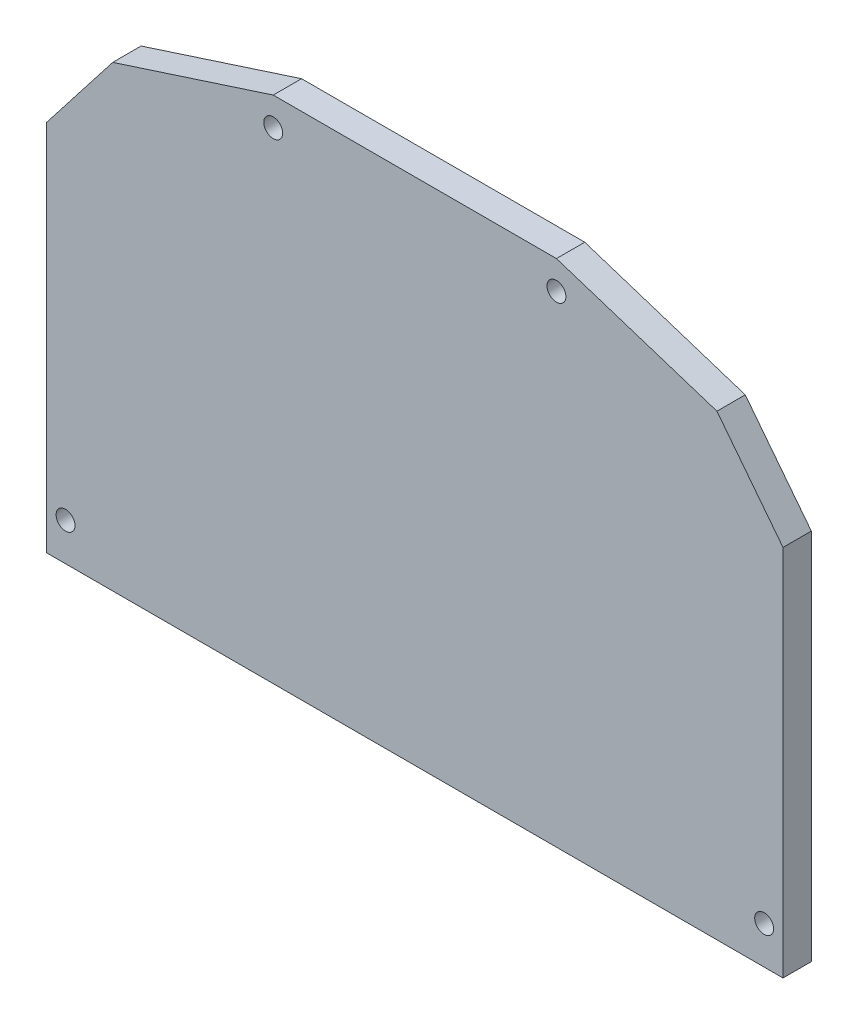
ISO-10303-21;
HEADER;
FILE_DESCRIPTION(('STEP AP214'),'2;1');
FILE_NAME('part.step','',(''),(''),'','','');
FILE_SCHEMA(('AUTOMOTIVE_DESIGN { 1 0 10303 214 1 1 1 1 }'));
ENDSEC;
DATA;
#1=APPLICATION_CONTEXT('core data for automotive mechanical design processes');
#2=APPLICATION_PROTOCOL_DEFINITION('international standard','automotive_design',2000,#1);
#3=PRODUCT_CONTEXT('',#1,'mechanical');
#4=PRODUCT('Part','Part','',(#3));
#5=PRODUCT_RELATED_PRODUCT_CATEGORY('part','',(#4));
#6=PRODUCT_DEFINITION_FORMATION('','',#4);
#7=PRODUCT_DEFINITION_CONTEXT('part definition',#1,'design');
#8=PRODUCT_DEFINITION('design','',#6,#7);
#9=PRODUCT_DEFINITION_SHAPE('','',#8);
#10=(LENGTH_UNIT() NAMED_UNIT(*) SI_UNIT(.MILLI.,.METRE.));
#11=(NAMED_UNIT(*) PLANE_ANGLE_UNIT() SI_UNIT($,.RADIAN.));
#12=(NAMED_UNIT(*) SI_UNIT($,.STERADIAN.) SOLID_ANGLE_UNIT());
#13=UNCERTAINTY_MEASURE_WITH_UNIT(LENGTH_MEASURE(1.E-05),#10,'distance_accuracy_value','');
#14=(GEOMETRIC_REPRESENTATION_CONTEXT(3) GLOBAL_UNCERTAINTY_ASSIGNED_CONTEXT((#13)) GLOBAL_UNIT_ASSIGNED_CONTEXT((#10,
#11,#12)) REPRESENTATION_CONTEXT('',''));
#15=CARTESIAN_POINT('',(0.,0.,0.));
#16=DIRECTION('',(0.,0.,1.));
#17=DIRECTION('',(1.,0.,0.));
#18=AXIS2_PLACEMENT_3D('',#15,#16,#17);
#19=CARTESIAN_POINT('',(0.,0.,3.));
#20=DIRECTION('',(0.,0.,1.));
#21=DIRECTION('',(1.,0.,0.));
#22=AXIS2_PLACEMENT_3D('',#19,#20,#21);
#23=PLANE('',#22);
#24=CARTESIAN_POINT('',(-84.,90.0000000000001,3.));
#25=DIRECTION('',(0.,0.,1.));
#26=DIRECTION('',(1.,0.,0.));
#27=AXIS2_PLACEMENT_3D('',#24,#25,#26);
#28=CIRCLE('',#27,0.999999999999998);
#29=CARTESIAN_POINT('',(-83.,90.0000000000001,3.));
#30=VERTEX_POINT('',#29);
#31=EDGE_CURVE('E190',#30,#30,#28,.T.);
#32=ORIENTED_EDGE('',*,*,#31,.F.);
#33=EDGE_LOOP('',(#32));
#34=FACE_BOUND('',#33,.T.);
#35=CARTESIAN_POINT('',(-32.,137.,3.));
#36=DIRECTION('',(0.,0.,1.));
#37=DIRECTION('',(1.,0.,0.));
#38=AXIS2_PLACEMENT_3D('',#35,#36,#37);
#39=CIRCLE('',#38,1.);
#40=CARTESIAN_POINT('',(-31.,137.,3.));
#41=VERTEX_POINT('',#40);
#42=EDGE_CURVE('E136',#41,#41,#39,.T.);
#43=ORIENTED_EDGE('',*,*,#42,.F.);
#44=EDGE_LOOP('',(#43));
#45=FACE_BOUND('',#44,.T.);
#46=DIRECTION('',(0.,1.,0.));
#47=VECTOR('',#46,1.);
#48=CARTESIAN_POINT('',(-8.,86.0000000000001,3.));
#49=LINE('',#48,#47);
#50=CARTESIAN_POINT('',(-8.,86.0000000000001,3.));
#51=VERTEX_POINT('',#50);
#52=CARTESIAN_POINT('',(-8.,125.5,3.));
#53=VERTEX_POINT('',#52);
#54=EDGE_CURVE('E147',#51,#53,#49,.T.);
#55=ORIENTED_EDGE('',*,*,#54,.T.);
#56=DIRECTION('',(-0.61394061351492,0.789352217376326,0.));
#57=VECTOR('',#56,1.);
#58=CARTESIAN_POINT('',(-8.,125.5,3.));
#59=LINE('',#58,#57);
#60=CARTESIAN_POINT('',(-15.,134.5,3.));
#61=VERTEX_POINT('',#60);
#62=EDGE_CURVE('E95',#53,#61,#59,.T.);
#63=ORIENTED_EDGE('',*,*,#62,.T.);
#64=DIRECTION('',(-0.951444518554411,0.307820285414663,0.));
#65=VECTOR('',#64,1.);
#66=CARTESIAN_POINT('',(-15.,134.5,3.));
#67=LINE('',#66,#65);
#68=CARTESIAN_POINT('',(-32.,140.,3.));
#69=VERTEX_POINT('',#68);
#70=EDGE_CURVE('E162',#61,#69,#67,.T.);
#71=ORIENTED_EDGE('',*,*,#70,.T.);
#72=DIRECTION('',(-1.,0.,0.));
#73=VECTOR('',#72,1.);
#74=CARTESIAN_POINT('',(-32.,140.,3.));
#75=LINE('',#74,#73);
#76=CARTESIAN_POINT('',(-62.,140.,3.));
#77=VERTEX_POINT('',#76);
#78=EDGE_CURVE('E175',#69,#77,#75,.T.);
#79=ORIENTED_EDGE('',*,*,#78,.T.);
#80=DIRECTION('',(-0.951444518554413,-0.307820285414659,0.));
#81=VECTOR('',#80,1.);
#82=CARTESIAN_POINT('',(-62.,140.,3.));
#83=LINE('',#82,#81);
#84=CARTESIAN_POINT('',(-79.,134.5,3.));
#85=VERTEX_POINT('',#84);
#86=EDGE_CURVE('E114',#77,#85,#83,.T.);
#87=ORIENTED_EDGE('',*,*,#86,.T.);
#88=DIRECTION('',(-0.613940613514922,-0.789352217376325,0.));
#89=VECTOR('',#88,1.);
#90=CARTESIAN_POINT('',(-79.,134.5,3.));
#91=LINE('',#90,#89);
#92=CARTESIAN_POINT('',(-86.,125.5,3.));
#93=VERTEX_POINT('',#92);
#94=EDGE_CURVE('E108',#85,#93,#91,.T.);
#95=ORIENTED_EDGE('',*,*,#94,.T.);
#96=DIRECTION('',(0.,-1.,0.));
#97=VECTOR('',#96,1.);
#98=CARTESIAN_POINT('',(-86.,125.5,3.));
#99=LINE('',#98,#97);
#100=CARTESIAN_POINT('',(-86.,86.0000000000001,3.));
#101=VERTEX_POINT('',#100);
#102=EDGE_CURVE('E112',#93,#101,#99,.T.);
#103=ORIENTED_EDGE('',*,*,#102,.T.);
#104=DIRECTION('',(1.,0.,0.));
#105=VECTOR('',#104,1.);
#106=CARTESIAN_POINT('',(-86.,86.0000000000001,3.));
#107=LINE('',#106,#105);
#108=EDGE_CURVE('E52',#101,#51,#107,.T.);
#109=ORIENTED_EDGE('',*,*,#108,.T.);
#110=EDGE_LOOP('',(#55,#63,#71,#79,#87,#95,#103,#109));
#111=FACE_BOUND('',#110,.T.);
#112=CARTESIAN_POINT('',(-62.,137.,3.));
#113=DIRECTION('',(0.,0.,1.));
#114=DIRECTION('',(1.,0.,0.));
#115=AXIS2_PLACEMENT_3D('',#112,#113,#114);
#116=CIRCLE('',#115,0.999999999999998);
#117=CARTESIAN_POINT('',(-61.,137.,3.));
#118=VERTEX_POINT('',#117);
#119=EDGE_CURVE('E184',#118,#118,#116,.T.);
#120=ORIENTED_EDGE('',*,*,#119,.F.);
#121=EDGE_LOOP('',(#120));
#122=FACE_BOUND('',#121,.T.);
#123=CARTESIAN_POINT('',(-10.,90.0000000000001,3.));
#124=DIRECTION('',(0.,0.,1.));
#125=DIRECTION('',(1.,0.,0.));
#126=AXIS2_PLACEMENT_3D('',#123,#124,#125);
#127=CIRCLE('',#126,1.);
#128=CARTESIAN_POINT('',(-9.00000000000001,90.0000000000001,3.));
#129=VERTEX_POINT('',#128);
#130=EDGE_CURVE('E196',#129,#129,#127,.T.);
#131=ORIENTED_EDGE('',*,*,#130,.F.);
#132=EDGE_LOOP('',(#131));
#133=FACE_BOUND('',#132,.T.);
#134=ADVANCED_FACE('F35',(#34,#45,#111,#122,#133),#23,.T.);
#135=CARTESIAN_POINT('',(0.,0.,0.));
#136=DIRECTION('',(0.,0.,1.));
#137=DIRECTION('',(1.,0.,0.));
#138=AXIS2_PLACEMENT_3D('',#135,#136,#137);
#139=PLANE('',#138);
#140=DIRECTION('',(0.,1.,0.));
#141=VECTOR('',#140,1.);
#142=CARTESIAN_POINT('',(-8.,86.0000000000001,0.));
#143=LINE('',#142,#141);
#144=CARTESIAN_POINT('',(-8.,86.0000000000001,0.));
#145=VERTEX_POINT('',#144);
#146=CARTESIAN_POINT('',(-8.,125.5,0.));
#147=VERTEX_POINT('',#146);
#148=EDGE_CURVE('E132',#145,#147,#143,.T.);
#149=ORIENTED_EDGE('',*,*,#148,.F.);
#150=DIRECTION('',(1.,0.,0.));
#151=VECTOR('',#150,1.);
#152=CARTESIAN_POINT('',(-86.,86.0000000000001,0.));
#153=LINE('',#152,#151);
#154=CARTESIAN_POINT('',(-86.,86.0000000000001,0.));
#155=VERTEX_POINT('',#154);
#156=EDGE_CURVE('E87',#155,#145,#153,.T.);
#157=ORIENTED_EDGE('',*,*,#156,.F.);
#158=DIRECTION('',(0.,-1.,0.));
#159=VECTOR('',#158,1.);
#160=CARTESIAN_POINT('',(-86.,125.5,0.));
#161=LINE('',#160,#159);
#162=CARTESIAN_POINT('',(-86.,125.5,0.));
#163=VERTEX_POINT('',#162);
#164=EDGE_CURVE('E81',#163,#155,#161,.T.);
#165=ORIENTED_EDGE('',*,*,#164,.F.);
#166=DIRECTION('',(-0.613940613514922,-0.789352217376325,0.));
#167=VECTOR('',#166,1.);
#168=CARTESIAN_POINT('',(-79.,134.5,0.));
#169=LINE('',#168,#167);
#170=CARTESIAN_POINT('',(-79.,134.5,0.));
#171=VERTEX_POINT('',#170);
#172=EDGE_CURVE('E122',#171,#163,#169,.T.);
#173=ORIENTED_EDGE('',*,*,#172,.F.);
#174=DIRECTION('',(-0.951444518554413,-0.307820285414659,0.));
#175=VECTOR('',#174,1.);
#176=CARTESIAN_POINT('',(-62.,140.,0.));
#177=LINE('',#176,#175);
#178=CARTESIAN_POINT('',(-62.,140.,0.));
#179=VERTEX_POINT('',#178);
#180=EDGE_CURVE('E142',#179,#171,#177,.T.);
#181=ORIENTED_EDGE('',*,*,#180,.F.);
#182=DIRECTION('',(-1.,0.,0.));
#183=VECTOR('',#182,1.);
#184=CARTESIAN_POINT('',(-32.,140.,0.));
#185=LINE('',#184,#183);
#186=CARTESIAN_POINT('',(-32.,140.,0.));
#187=VERTEX_POINT('',#186);
#188=EDGE_CURVE('E140',#187,#179,#185,.T.);
#189=ORIENTED_EDGE('',*,*,#188,.F.);
#190=DIRECTION('',(-0.951444518554411,0.307820285414663,0.));
#191=VECTOR('',#190,1.);
#192=CARTESIAN_POINT('',(-15.,134.5,0.));
#193=LINE('',#192,#191);
#194=CARTESIAN_POINT('',(-15.,134.5,0.));
#195=VERTEX_POINT('',#194);
#196=EDGE_CURVE('E138',#195,#187,#193,.T.);
#197=ORIENTED_EDGE('',*,*,#196,.F.);
#198=DIRECTION('',(-0.61394061351492,0.789352217376326,0.));
#199=VECTOR('',#198,1.);
#200=CARTESIAN_POINT('',(-8.,125.5,0.));
#201=LINE('',#200,#199);
#202=EDGE_CURVE('E135',#147,#195,#201,.T.);
#203=ORIENTED_EDGE('',*,*,#202,.F.);
#204=EDGE_LOOP('',(#149,#157,#165,#173,#181,#189,#197,#203));
#205=FACE_BOUND('',#204,.T.);
#206=CARTESIAN_POINT('',(-32.,137.,0.));
#207=DIRECTION('',(0.,0.,1.));
#208=DIRECTION('',(1.,0.,0.));
#209=AXIS2_PLACEMENT_3D('',#206,#207,#208);
#210=CIRCLE('',#209,1.);
#211=CARTESIAN_POINT('',(-31.,137.,0.));
#212=VERTEX_POINT('',#211);
#213=EDGE_CURVE('E181',#212,#212,#210,.T.);
#214=ORIENTED_EDGE('',*,*,#213,.T.);
#215=EDGE_LOOP('',(#214));
#216=FACE_BOUND('',#215,.T.);
#217=CARTESIAN_POINT('',(-62.,137.,0.));
#218=DIRECTION('',(0.,0.,1.));
#219=DIRECTION('',(1.,0.,0.));
#220=AXIS2_PLACEMENT_3D('',#217,#218,#219);
#221=CIRCLE('',#220,0.999999999999998);
#222=CARTESIAN_POINT('',(-61.,137.,0.));
#223=VERTEX_POINT('',#222);
#224=EDGE_CURVE('E187',#223,#223,#221,.T.);
#225=ORIENTED_EDGE('',*,*,#224,.T.);
#226=EDGE_LOOP('',(#225));
#227=FACE_BOUND('',#226,.T.);
#228=CARTESIAN_POINT('',(-84.,90.0000000000001,0.));
#229=DIRECTION('',(0.,0.,1.));
#230=DIRECTION('',(1.,0.,0.));
#231=AXIS2_PLACEMENT_3D('',#228,#229,#230);
#232=CIRCLE('',#231,0.999999999999998);
#233=CARTESIAN_POINT('',(-83.,90.0000000000001,0.));
#234=VERTEX_POINT('',#233);
#235=EDGE_CURVE('E193',#234,#234,#232,.T.);
#236=ORIENTED_EDGE('',*,*,#235,.T.);
#237=EDGE_LOOP('',(#236));
#238=FACE_BOUND('',#237,.T.);
#239=CARTESIAN_POINT('',(-10.,90.0000000000001,0.));
#240=DIRECTION('',(0.,0.,1.));
#241=DIRECTION('',(1.,0.,0.));
#242=AXIS2_PLACEMENT_3D('',#239,#240,#241);
#243=CIRCLE('',#242,1.);
#244=CARTESIAN_POINT('',(-9.00000000000001,90.0000000000001,0.));
#245=VERTEX_POINT('',#244);
#246=EDGE_CURVE('E199',#245,#245,#243,.T.);
#247=ORIENTED_EDGE('',*,*,#246,.T.);
#248=EDGE_LOOP('',(#247));
#249=FACE_BOUND('',#248,.T.);
#250=ADVANCED_FACE('F166',(#205,#216,#227,#238,#249),#139,.F.);
#251=CARTESIAN_POINT('',(-8.,86.0000000000001,3.));
#252=DIRECTION('',(-1.,0.,0.));
#253=DIRECTION('',(0.,-1.,0.));
#254=AXIS2_PLACEMENT_3D('',#251,#252,#253);
#255=PLANE('',#254);
#256=ORIENTED_EDGE('',*,*,#148,.T.);
#257=DIRECTION('',(0.,0.,-1.));
#258=VECTOR('',#257,1.);
#259=CARTESIAN_POINT('',(-8.,125.5,3.));
#260=LINE('',#259,#258);
#261=EDGE_CURVE('E11',#53,#147,#260,.T.);
#262=ORIENTED_EDGE('',*,*,#261,.F.);
#263=ORIENTED_EDGE('',*,*,#54,.F.);
#264=DIRECTION('',(0.,0.,-1.));
#265=VECTOR('',#264,1.);
#266=CARTESIAN_POINT('',(-8.,86.0000000000001,3.));
#267=LINE('',#266,#265);
#268=EDGE_CURVE('E128',#51,#145,#267,.T.);
#269=ORIENTED_EDGE('',*,*,#268,.T.);
#270=EDGE_LOOP('',(#256,#262,#263,#269));
#271=FACE_BOUND('',#270,.T.);
#272=ADVANCED_FACE('F37',(#271),#255,.F.);
#273=CARTESIAN_POINT('',(-8.,125.5,3.));
#274=DIRECTION('',(-0.789352217376326,-0.61394061351492,0.));
#275=DIRECTION('',(0.61394061351492,-0.789352217376326,0.));
#276=AXIS2_PLACEMENT_3D('',#273,#274,#275);
#277=PLANE('',#276);
#278=ORIENTED_EDGE('',*,*,#202,.T.);
#279=DIRECTION('',(0.,0.,-1.));
#280=VECTOR('',#279,1.);
#281=CARTESIAN_POINT('',(-15.,134.5,3.));
#282=LINE('',#281,#280);
#283=EDGE_CURVE('E44',#61,#195,#282,.T.);
#284=ORIENTED_EDGE('',*,*,#283,.F.);
#285=ORIENTED_EDGE('',*,*,#62,.F.);
#286=ORIENTED_EDGE('',*,*,#261,.T.);
#287=EDGE_LOOP('',(#278,#284,#285,#286));
#288=FACE_BOUND('',#287,.T.);
#289=ADVANCED_FACE('F233',(#288),#277,.F.);
#290=CARTESIAN_POINT('',(-15.,134.5,3.));
#291=DIRECTION('',(-0.307820285414663,-0.951444518554411,0.));
#292=DIRECTION('',(0.951444518554411,-0.307820285414663,0.));
#293=AXIS2_PLACEMENT_3D('',#290,#291,#292);
#294=PLANE('',#293);
#295=ORIENTED_EDGE('',*,*,#196,.T.);
#296=DIRECTION('',(0.,0.,-1.));
#297=VECTOR('',#296,1.);
#298=CARTESIAN_POINT('',(-32.,140.,3.));
#299=LINE('',#298,#297);
#300=EDGE_CURVE('E154',#69,#187,#299,.T.);
#301=ORIENTED_EDGE('',*,*,#300,.F.);
#302=ORIENTED_EDGE('',*,*,#70,.F.);
#303=ORIENTED_EDGE('',*,*,#283,.T.);
#304=EDGE_LOOP('',(#295,#301,#302,#303));
#305=FACE_BOUND('',#304,.T.);
#306=ADVANCED_FACE('F160',(#305),#294,.F.);
#307=CARTESIAN_POINT('',(-32.,140.,3.));
#308=DIRECTION('',(0.,-1.,0.));
#309=DIRECTION('',(1.,0.,0.));
#310=AXIS2_PLACEMENT_3D('',#307,#308,#309);
#311=PLANE('',#310);
#312=ORIENTED_EDGE('',*,*,#188,.T.);
#313=DIRECTION('',(0.,0.,-1.));
#314=VECTOR('',#313,1.);
#315=CARTESIAN_POINT('',(-62.,140.,3.));
#316=LINE('',#315,#314);
#317=EDGE_CURVE('E151',#77,#179,#316,.T.);
#318=ORIENTED_EDGE('',*,*,#317,.F.);
#319=ORIENTED_EDGE('',*,*,#78,.F.);
#320=ORIENTED_EDGE('',*,*,#300,.T.);
#321=EDGE_LOOP('',(#312,#318,#319,#320));
#322=FACE_BOUND('',#321,.T.);
#323=ADVANCED_FACE('F171',(#322),#311,.F.);
#324=CARTESIAN_POINT('',(-62.,140.,3.));
#325=DIRECTION('',(0.307820285414659,-0.951444518554412,0.));
#326=DIRECTION('',(0.951444518554413,0.307820285414659,0.));
#327=AXIS2_PLACEMENT_3D('',#324,#325,#326);
#328=PLANE('',#327);
#329=ORIENTED_EDGE('',*,*,#180,.T.);
#330=DIRECTION('',(0.,0.,-1.));
#331=VECTOR('',#330,1.);
#332=CARTESIAN_POINT('',(-79.,134.5,3.));
#333=LINE('',#332,#331);
#334=EDGE_CURVE('E123',#85,#171,#333,.T.);
#335=ORIENTED_EDGE('',*,*,#334,.F.);
#336=ORIENTED_EDGE('',*,*,#86,.F.);
#337=ORIENTED_EDGE('',*,*,#317,.T.);
#338=EDGE_LOOP('',(#329,#335,#336,#337));
#339=FACE_BOUND('',#338,.T.);
#340=ADVANCED_FACE('F174',(#339),#328,.F.);
#341=CARTESIAN_POINT('',(-79.,134.5,3.));
#342=DIRECTION('',(0.789352217376325,-0.613940613514922,0.));
#343=DIRECTION('',(0.613940613514922,0.789352217376325,0.));
#344=AXIS2_PLACEMENT_3D('',#341,#342,#343);
#345=PLANE('',#344);
#346=ORIENTED_EDGE('',*,*,#172,.T.);
#347=DIRECTION('',(0.,0.,-1.));
#348=VECTOR('',#347,1.);
#349=CARTESIAN_POINT('',(-86.,125.5,3.));
#350=LINE('',#349,#348);
#351=EDGE_CURVE('E119',#93,#163,#350,.T.);
#352=ORIENTED_EDGE('',*,*,#351,.F.);
#353=ORIENTED_EDGE('',*,*,#94,.F.);
#354=ORIENTED_EDGE('',*,*,#334,.T.);
#355=EDGE_LOOP('',(#346,#352,#353,#354));
#356=FACE_BOUND('',#355,.T.);
#357=ADVANCED_FACE('F120',(#356),#345,.F.);
#358=CARTESIAN_POINT('',(-86.,125.5,3.));
#359=DIRECTION('',(1.,0.,0.));
#360=DIRECTION('',(0.,0.,-1.));
#361=AXIS2_PLACEMENT_3D('',#358,#359,#360);
#362=PLANE('',#361);
#363=ORIENTED_EDGE('',*,*,#164,.T.);
#364=DIRECTION('',(0.,0.,-1.));
#365=VECTOR('',#364,1.);
#366=CARTESIAN_POINT('',(-86.,86.0000000000001,3.));
#367=LINE('',#366,#365);
#368=EDGE_CURVE('E124',#101,#155,#367,.T.);
#369=ORIENTED_EDGE('',*,*,#368,.F.);
#370=ORIENTED_EDGE('',*,*,#102,.F.);
#371=ORIENTED_EDGE('',*,*,#351,.T.);
#372=EDGE_LOOP('',(#363,#369,#370,#371));
#373=FACE_BOUND('',#372,.T.);
#374=ADVANCED_FACE('F126',(#373),#362,.F.);
#375=CARTESIAN_POINT('',(-86.,86.0000000000001,3.));
#376=DIRECTION('',(0.,1.,0.));
#377=DIRECTION('',(0.,0.,1.));
#378=AXIS2_PLACEMENT_3D('',#375,#376,#377);
#379=PLANE('',#378);
#380=ORIENTED_EDGE('',*,*,#156,.T.);
#381=ORIENTED_EDGE('',*,*,#268,.F.);
#382=ORIENTED_EDGE('',*,*,#108,.F.);
#383=ORIENTED_EDGE('',*,*,#368,.T.);
#384=EDGE_LOOP('',(#380,#381,#382,#383));
#385=FACE_BOUND('',#384,.T.);
#386=ADVANCED_FACE('F221',(#385),#379,.F.);
#387=CARTESIAN_POINT('',(-32.,137.,3.));
#388=DIRECTION('',(0.,0.,-1.));
#389=DIRECTION('',(-1.,0.,0.));
#390=AXIS2_PLACEMENT_3D('',#387,#388,#389);
#391=CYLINDRICAL_SURFACE('',#390,1.);
#392=ORIENTED_EDGE('',*,*,#42,.T.);
#393=EDGE_LOOP('',(#392));
#394=FACE_BOUND('',#393,.T.);
#395=ORIENTED_EDGE('',*,*,#213,.F.);
#396=EDGE_LOOP('',(#395));
#397=FACE_BOUND('',#396,.T.);
#398=ADVANCED_FACE('F218',(#394,#397),#391,.F.);
#399=CARTESIAN_POINT('',(-62.,137.,3.));
#400=DIRECTION('',(0.,0.,-1.));
#401=DIRECTION('',(-1.,0.,0.));
#402=AXIS2_PLACEMENT_3D('',#399,#400,#401);
#403=CYLINDRICAL_SURFACE('',#402,0.999999999999998);
#404=ORIENTED_EDGE('',*,*,#119,.T.);
#405=EDGE_LOOP('',(#404));
#406=FACE_BOUND('',#405,.T.);
#407=ORIENTED_EDGE('',*,*,#224,.F.);
#408=EDGE_LOOP('',(#407));
#409=FACE_BOUND('',#408,.T.);
#410=ADVANCED_FACE('F297',(#406,#409),#403,.F.);
#411=CARTESIAN_POINT('',(-84.,90.0000000000001,3.));
#412=DIRECTION('',(0.,0.,-1.));
#413=DIRECTION('',(-1.,0.,0.));
#414=AXIS2_PLACEMENT_3D('',#411,#412,#413);
#415=CYLINDRICAL_SURFACE('',#414,0.999999999999998);
#416=ORIENTED_EDGE('',*,*,#31,.T.);
#417=EDGE_LOOP('',(#416));
#418=FACE_BOUND('',#417,.T.);
#419=ORIENTED_EDGE('',*,*,#235,.F.);
#420=EDGE_LOOP('',(#419));
#421=FACE_BOUND('',#420,.T.);
#422=ADVANCED_FACE('F305',(#418,#421),#415,.F.);
#423=CARTESIAN_POINT('',(-10.,90.0000000000001,3.));
#424=DIRECTION('',(0.,0.,-1.));
#425=DIRECTION('',(-1.,0.,0.));
#426=AXIS2_PLACEMENT_3D('',#423,#424,#425);
#427=CYLINDRICAL_SURFACE('',#426,1.);
#428=ORIENTED_EDGE('',*,*,#130,.T.);
#429=EDGE_LOOP('',(#428));
#430=FACE_BOUND('',#429,.T.);
#431=ORIENTED_EDGE('',*,*,#246,.F.);
#432=EDGE_LOOP('',(#431));
#433=FACE_BOUND('',#432,.T.);
#434=ADVANCED_FACE('F205',(#430,#433),#427,.F.);
#435=CLOSED_SHELL('',(#134,#250,#272,#289,#306,#323,#340,#357,#374,#386,#398,#410,#422,#434));
#436=MANIFOLD_SOLID_BREP('B2',#435);
#437=ADVANCED_BREP_SHAPE_REPRESENTATION('',(#18,#436),#14);
#438=SHAPE_DEFINITION_REPRESENTATION(#9,#437);
ENDSEC;
END-ISO-10303-21;
